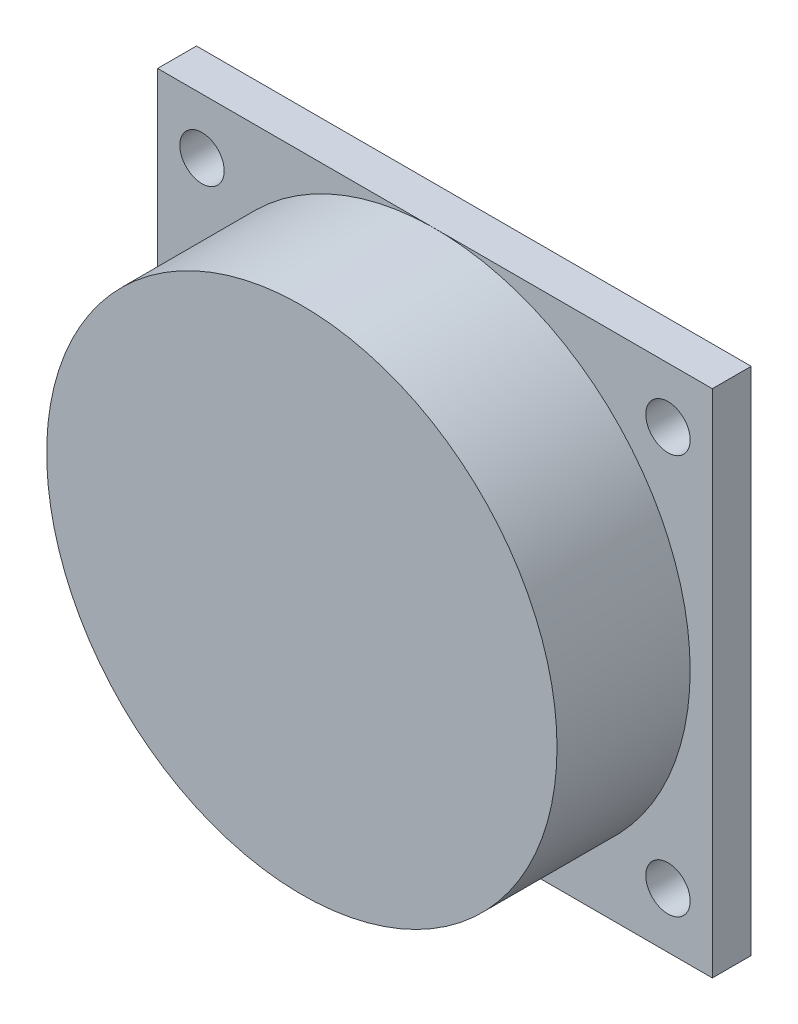
ISO-10303-21;
HEADER;
FILE_DESCRIPTION(('STEP AP214'),'2;1');
FILE_NAME('part.step','',(''),(''),'','','');
FILE_SCHEMA(('AUTOMOTIVE_DESIGN { 1 0 10303 214 1 1 1 1 }'));
ENDSEC;
DATA;
#1=APPLICATION_CONTEXT('core data for automotive mechanical design processes');
#2=APPLICATION_PROTOCOL_DEFINITION('international standard','automotive_design',2000,#1);
#3=PRODUCT_CONTEXT('',#1,'mechanical');
#4=PRODUCT('Part','Part','',(#3));
#5=PRODUCT_RELATED_PRODUCT_CATEGORY('part','',(#4));
#6=PRODUCT_DEFINITION_FORMATION('','',#4);
#7=PRODUCT_DEFINITION_CONTEXT('part definition',#1,'design');
#8=PRODUCT_DEFINITION('design','',#6,#7);
#9=PRODUCT_DEFINITION_SHAPE('','',#8);
#10=(LENGTH_UNIT() NAMED_UNIT(*) SI_UNIT(.MILLI.,.METRE.));
#11=(NAMED_UNIT(*) PLANE_ANGLE_UNIT() SI_UNIT($,.RADIAN.));
#12=(NAMED_UNIT(*) SI_UNIT($,.STERADIAN.) SOLID_ANGLE_UNIT());
#13=UNCERTAINTY_MEASURE_WITH_UNIT(LENGTH_MEASURE(1.E-05),#10,'distance_accuracy_value','');
#14=(GEOMETRIC_REPRESENTATION_CONTEXT(3) GLOBAL_UNCERTAINTY_ASSIGNED_CONTEXT((#13)) GLOBAL_UNIT_ASSIGNED_CONTEXT((#10,
#11,#12)) REPRESENTATION_CONTEXT('',''));
#15=CARTESIAN_POINT('',(0.,0.,0.));
#16=DIRECTION('',(0.,0.,1.));
#17=DIRECTION('',(1.,0.,0.));
#18=AXIS2_PLACEMENT_3D('',#15,#16,#17);
#19=CARTESIAN_POINT('',(0.,0.,-1.75));
#20=DIRECTION('',(0.,0.,-1.));
#21=DIRECTION('',(-1.,0.,0.));
#22=AXIS2_PLACEMENT_3D('',#19,#20,#21);
#23=PLANE('',#22);
#24=CARTESIAN_POINT('',(-10.5,9.,-1.75));
#25=DIRECTION('',(0.,0.,1.));
#26=DIRECTION('',(1.,0.,0.));
#27=AXIS2_PLACEMENT_3D('',#24,#25,#26);
#28=CIRCLE('',#27,0.999999999999999);
#29=CARTESIAN_POINT('',(-9.5,9.,-1.75));
#30=VERTEX_POINT('',#29);
#31=EDGE_CURVE('E205',#30,#30,#28,.T.);
#32=ORIENTED_EDGE('',*,*,#31,.T.);
#33=EDGE_LOOP('',(#32));
#34=FACE_BOUND('',#33,.T.);
#35=CARTESIAN_POINT('',(10.5,9.,-1.75));
#36=DIRECTION('',(0.,0.,1.));
#37=DIRECTION('',(1.,0.,0.));
#38=AXIS2_PLACEMENT_3D('',#35,#36,#37);
#39=CIRCLE('',#38,0.999999999999999);
#40=CARTESIAN_POINT('',(11.5,9.,-1.75));
#41=VERTEX_POINT('',#40);
#42=EDGE_CURVE('E199',#41,#41,#39,.T.);
#43=ORIENTED_EDGE('',*,*,#42,.T.);
#44=EDGE_LOOP('',(#43));
#45=FACE_BOUND('',#44,.T.);
#46=CARTESIAN_POINT('',(10.5,-9.,-1.75));
#47=DIRECTION('',(0.,0.,1.));
#48=DIRECTION('',(1.,0.,0.));
#49=AXIS2_PLACEMENT_3D('',#46,#47,#48);
#50=CIRCLE('',#49,0.999999999999999);
#51=CARTESIAN_POINT('',(11.5,-9.,-1.75));
#52=VERTEX_POINT('',#51);
#53=EDGE_CURVE('E193',#52,#52,#50,.T.);
#54=ORIENTED_EDGE('',*,*,#53,.T.);
#55=EDGE_LOOP('',(#54));
#56=FACE_BOUND('',#55,.T.);
#57=CARTESIAN_POINT('',(-10.5,-8.5,-1.75));
#58=DIRECTION('',(0.,0.,1.));
#59=DIRECTION('',(1.,0.,0.));
#60=AXIS2_PLACEMENT_3D('',#57,#58,#59);
#61=CIRCLE('',#60,0.999999999999999);
#62=CARTESIAN_POINT('',(-9.5,-8.5,-1.75));
#63=VERTEX_POINT('',#62);
#64=EDGE_CURVE('E130',#63,#63,#61,.T.);
#65=ORIENTED_EDGE('',*,*,#64,.T.);
#66=EDGE_LOOP('',(#65));
#67=FACE_BOUND('',#66,.T.);
#68=DIRECTION('',(0.,-1.,0.));
#69=VECTOR('',#68,1.);
#70=CARTESIAN_POINT('',(-2.6349857419825,-6.5,-1.75));
#71=LINE('',#70,#69);
#72=CARTESIAN_POINT('',(-2.6349857419825,-9.90552119474533,-1.75));
#73=VERTEX_POINT('',#72);
#74=CARTESIAN_POINT('',(-2.6349857419825,-11.5,-1.75));
#75=VERTEX_POINT('',#74);
#76=EDGE_CURVE('E122',#73,#75,#71,.T.);
#77=ORIENTED_EDGE('',*,*,#76,.T.);
#78=DIRECTION('',(-1.,0.,0.));
#79=VECTOR('',#78,1.);
#80=CARTESIAN_POINT('',(-12.5,-11.5,-1.75));
#81=LINE('',#80,#79);
#82=CARTESIAN_POINT('',(-12.5,-11.5,-1.75));
#83=VERTEX_POINT('',#82);
#84=EDGE_CURVE('E133',#75,#83,#81,.T.);
#85=ORIENTED_EDGE('',*,*,#84,.T.);
#86=DIRECTION('',(0.,1.,0.));
#87=VECTOR('',#86,1.);
#88=CARTESIAN_POINT('',(-12.5,-11.5,-1.75));
#89=LINE('',#88,#87);
#90=CARTESIAN_POINT('',(-12.5,11.5,-1.75));
#91=VERTEX_POINT('',#90);
#92=EDGE_CURVE('E147',#83,#91,#89,.T.);
#93=ORIENTED_EDGE('',*,*,#92,.T.);
#94=DIRECTION('',(1.,0.,0.));
#95=VECTOR('',#94,1.);
#96=CARTESIAN_POINT('',(-12.5,11.5,-1.75));
#97=LINE('',#96,#95);
#98=CARTESIAN_POINT('',(12.5,11.5,-1.75));
#99=VERTEX_POINT('',#98);
#100=EDGE_CURVE('E69',#91,#99,#97,.T.);
#101=ORIENTED_EDGE('',*,*,#100,.T.);
#102=DIRECTION('',(0.,-1.,0.));
#103=VECTOR('',#102,1.);
#104=CARTESIAN_POINT('',(12.5,-11.5,-1.75));
#105=LINE('',#104,#103);
#106=CARTESIAN_POINT('',(12.5,-11.5,-1.75));
#107=VERTEX_POINT('',#106);
#108=EDGE_CURVE('E145',#99,#107,#105,.T.);
#109=ORIENTED_EDGE('',*,*,#108,.T.);
#110=CARTESIAN_POINT('',(2.65652164277661,-11.5,-1.75));
#111=VERTEX_POINT('',#110);
#112=EDGE_CURVE('E98',#107,#111,#81,.T.);
#113=ORIENTED_EDGE('',*,*,#112,.T.);
#114=DIRECTION('',(0.,-1.,0.));
#115=VECTOR('',#114,1.);
#116=CARTESIAN_POINT('',(2.65652164277661,-6.5,-1.75));
#117=LINE('',#116,#115);
#118=CARTESIAN_POINT('',(2.65652164277661,-9.89976730845021,-1.75));
#119=VERTEX_POINT('',#118);
#120=EDGE_CURVE('E138',#119,#111,#117,.T.);
#121=ORIENTED_EDGE('',*,*,#120,.F.);
#122=CARTESIAN_POINT('',(0.,0.,-1.75));
#123=DIRECTION('',(0.,0.,-1.));
#124=DIRECTION('',(-1.,0.,0.));
#125=AXIS2_PLACEMENT_3D('',#122,#123,#124);
#126=CIRCLE('',#125,10.25);
#127=EDGE_CURVE('E137',#73,#119,#126,.T.);
#128=ORIENTED_EDGE('',*,*,#127,.F.);
#129=EDGE_LOOP('',(#77,#85,#93,#101,#109,#113,#121,#128));
#130=FACE_BOUND('',#129,.T.);
#131=ADVANCED_FACE('F45',(#34,#45,#56,#67,#130),#23,.T.);
#132=CARTESIAN_POINT('',(0.,0.,0.));
#133=DIRECTION('',(0.,0.,-1.));
#134=DIRECTION('',(-1.,0.,0.));
#135=AXIS2_PLACEMENT_3D('',#132,#133,#134);
#136=PLANE('',#135);
#137=CARTESIAN_POINT('',(-10.5,9.,0.));
#138=DIRECTION('',(0.,0.,1.));
#139=DIRECTION('',(1.,0.,0.));
#140=AXIS2_PLACEMENT_3D('',#137,#138,#139);
#141=CIRCLE('',#140,0.999999999999987);
#142=CARTESIAN_POINT('',(-9.50000000000001,9.,0.));
#143=VERTEX_POINT('',#142);
#144=EDGE_CURVE('E208',#143,#143,#141,.T.);
#145=ORIENTED_EDGE('',*,*,#144,.F.);
#146=EDGE_LOOP('',(#145));
#147=FACE_BOUND('',#146,.T.);
#148=CARTESIAN_POINT('',(10.5,9.,0.));
#149=DIRECTION('',(0.,0.,1.));
#150=DIRECTION('',(1.,0.,0.));
#151=AXIS2_PLACEMENT_3D('',#148,#149,#150);
#152=CIRCLE('',#151,0.999999999999987);
#153=CARTESIAN_POINT('',(11.5,9.,0.));
#154=VERTEX_POINT('',#153);
#155=EDGE_CURVE('E202',#154,#154,#152,.T.);
#156=ORIENTED_EDGE('',*,*,#155,.F.);
#157=EDGE_LOOP('',(#156));
#158=FACE_BOUND('',#157,.T.);
#159=CARTESIAN_POINT('',(10.5,-9.,0.));
#160=DIRECTION('',(0.,0.,1.));
#161=DIRECTION('',(1.,0.,0.));
#162=AXIS2_PLACEMENT_3D('',#159,#160,#161);
#163=CIRCLE('',#162,0.999999999999987);
#164=CARTESIAN_POINT('',(11.5,-9.,0.));
#165=VERTEX_POINT('',#164);
#166=EDGE_CURVE('E196',#165,#165,#163,.T.);
#167=ORIENTED_EDGE('',*,*,#166,.F.);
#168=EDGE_LOOP('',(#167));
#169=FACE_BOUND('',#168,.T.);
#170=CARTESIAN_POINT('',(-10.5,-8.5,0.));
#171=DIRECTION('',(0.,0.,1.));
#172=DIRECTION('',(1.,0.,0.));
#173=AXIS2_PLACEMENT_3D('',#170,#171,#172);
#174=CIRCLE('',#173,0.999999999999987);
#175=CARTESIAN_POINT('',(-9.50000000000001,-8.5,0.));
#176=VERTEX_POINT('',#175);
#177=EDGE_CURVE('E190',#176,#176,#174,.T.);
#178=ORIENTED_EDGE('',*,*,#177,.F.);
#179=EDGE_LOOP('',(#178));
#180=FACE_BOUND('',#179,.T.);
#181=DIRECTION('',(0.,-1.,0.));
#182=VECTOR('',#181,1.);
#183=CARTESIAN_POINT('',(12.5,-11.5,0.));
#184=LINE('',#183,#182);
#185=CARTESIAN_POINT('',(12.5,11.5,0.));
#186=VERTEX_POINT('',#185);
#187=CARTESIAN_POINT('',(12.5,-11.5,0.));
#188=VERTEX_POINT('',#187);
#189=EDGE_CURVE('E154',#186,#188,#184,.T.);
#190=ORIENTED_EDGE('',*,*,#189,.F.);
#191=DIRECTION('',(1.,0.,0.));
#192=VECTOR('',#191,1.);
#193=CARTESIAN_POINT('',(-12.5,11.5,0.));
#194=LINE('',#193,#192);
#195=CARTESIAN_POINT('',(-12.5,11.5,0.));
#196=VERTEX_POINT('',#195);
#197=EDGE_CURVE('E90',#196,#186,#194,.T.);
#198=ORIENTED_EDGE('',*,*,#197,.F.);
#199=DIRECTION('',(0.,1.,0.));
#200=VECTOR('',#199,1.);
#201=CARTESIAN_POINT('',(-12.5,-11.5,0.));
#202=LINE('',#201,#200);
#203=CARTESIAN_POINT('',(-12.5,-11.5,0.));
#204=VERTEX_POINT('',#203);
#205=EDGE_CURVE('E159',#204,#196,#202,.T.);
#206=ORIENTED_EDGE('',*,*,#205,.F.);
#207=DIRECTION('',(-1.,0.,0.));
#208=VECTOR('',#207,1.);
#209=CARTESIAN_POINT('',(-12.5,-11.5,0.));
#210=LINE('',#209,#208);
#211=EDGE_CURVE('E157',#188,#204,#210,.T.);
#212=ORIENTED_EDGE('',*,*,#211,.F.);
#213=EDGE_LOOP('',(#190,#198,#206,#212));
#214=FACE_BOUND('',#213,.T.);
#215=CARTESIAN_POINT('',(0.,0.,0.));
#216=DIRECTION('',(0.,0.,-1.));
#217=DIRECTION('',(-1.,0.,0.));
#218=AXIS2_PLACEMENT_3D('',#215,#216,#217);
#219=CIRCLE('',#218,10.25);
#220=CARTESIAN_POINT('',(-10.25,0.,0.));
#221=VERTEX_POINT('',#220);
#222=EDGE_CURVE('E181',#221,#221,#219,.T.);
#223=ORIENTED_EDGE('',*,*,#222,.T.);
#224=EDGE_LOOP('',(#223));
#225=FACE_BOUND('',#224,.T.);
#226=ADVANCED_FACE('F214',(#147,#158,#169,#180,#214,#225),#136,.F.);
#227=CARTESIAN_POINT('',(12.5,-11.5,-1.75));
#228=DIRECTION('',(-1.,0.,0.));
#229=DIRECTION('',(0.,-1.,0.));
#230=AXIS2_PLACEMENT_3D('',#227,#228,#229);
#231=PLANE('',#230);
#232=ORIENTED_EDGE('',*,*,#189,.T.);
#233=DIRECTION('',(0.,0.,1.));
#234=VECTOR('',#233,1.);
#235=CARTESIAN_POINT('',(12.5,-11.5,-1.75));
#236=LINE('',#235,#234);
#237=EDGE_CURVE('E166',#107,#188,#236,.T.);
#238=ORIENTED_EDGE('',*,*,#237,.F.);
#239=ORIENTED_EDGE('',*,*,#108,.F.);
#240=DIRECTION('',(0.,0.,1.));
#241=VECTOR('',#240,1.);
#242=CARTESIAN_POINT('',(12.5,11.5,-1.75));
#243=LINE('',#242,#241);
#244=EDGE_CURVE('E153',#99,#186,#243,.T.);
#245=ORIENTED_EDGE('',*,*,#244,.T.);
#246=EDGE_LOOP('',(#232,#238,#239,#245));
#247=FACE_BOUND('',#246,.T.);
#248=ADVANCED_FACE('F47',(#247),#231,.F.);
#249=CARTESIAN_POINT('',(-12.5,-11.5,-1.75));
#250=DIRECTION('',(0.,1.,0.));
#251=DIRECTION('',(-1.,0.,0.));
#252=AXIS2_PLACEMENT_3D('',#249,#250,#251);
#253=PLANE('',#252);
#254=ORIENTED_EDGE('',*,*,#84,.F.);
#255=DIRECTION('',(0.,0.,-1.));
#256=VECTOR('',#255,1.);
#257=CARTESIAN_POINT('',(-2.6349857419825,-11.5,-1.75));
#258=LINE('',#257,#256);
#259=CARTESIAN_POINT('',(-2.6349857419825,-11.5,-1.51062213355671));
#260=VERTEX_POINT('',#259);
#261=EDGE_CURVE('E119',#260,#75,#258,.T.);
#262=ORIENTED_EDGE('',*,*,#261,.F.);
#263=DIRECTION('',(-1.,0.,0.));
#264=VECTOR('',#263,1.);
#265=CARTESIAN_POINT('',(-2.6349857419825,-11.5,-1.51062213355671));
#266=LINE('',#265,#264);
#267=CARTESIAN_POINT('',(2.65652164277661,-11.5,-1.51062213355671));
#268=VERTEX_POINT('',#267);
#269=EDGE_CURVE('E139',#268,#260,#266,.T.);
#270=ORIENTED_EDGE('',*,*,#269,.F.);
#271=DIRECTION('',(0.,0.,1.));
#272=VECTOR('',#271,1.);
#273=CARTESIAN_POINT('',(2.65652164277661,-11.5,-1.75));
#274=LINE('',#273,#272);
#275=EDGE_CURVE('E129',#111,#268,#274,.T.);
#276=ORIENTED_EDGE('',*,*,#275,.F.);
#277=ORIENTED_EDGE('',*,*,#112,.F.);
#278=ORIENTED_EDGE('',*,*,#237,.T.);
#279=ORIENTED_EDGE('',*,*,#211,.T.);
#280=DIRECTION('',(0.,0.,1.));
#281=VECTOR('',#280,1.);
#282=CARTESIAN_POINT('',(-12.5,-11.5,-1.75));
#283=LINE('',#282,#281);
#284=EDGE_CURVE('E143',#83,#204,#283,.T.);
#285=ORIENTED_EDGE('',*,*,#284,.F.);
#286=EDGE_LOOP('',(#254,#262,#270,#276,#277,#278,#279,#285));
#287=FACE_BOUND('',#286,.T.);
#288=ADVANCED_FACE('F141',(#287),#253,.F.);
#289=CARTESIAN_POINT('',(-12.5,-11.5,-1.75));
#290=DIRECTION('',(1.,0.,0.));
#291=DIRECTION('',(0.,0.,-1.));
#292=AXIS2_PLACEMENT_3D('',#289,#290,#291);
#293=PLANE('',#292);
#294=ORIENTED_EDGE('',*,*,#205,.T.);
#295=DIRECTION('',(0.,0.,1.));
#296=VECTOR('',#295,1.);
#297=CARTESIAN_POINT('',(-12.5,11.5,-1.75));
#298=LINE('',#297,#296);
#299=EDGE_CURVE('E163',#91,#196,#298,.T.);
#300=ORIENTED_EDGE('',*,*,#299,.F.);
#301=ORIENTED_EDGE('',*,*,#92,.F.);
#302=ORIENTED_EDGE('',*,*,#284,.T.);
#303=EDGE_LOOP('',(#294,#300,#301,#302));
#304=FACE_BOUND('',#303,.T.);
#305=ADVANCED_FACE('F232',(#304),#293,.F.);
#306=CARTESIAN_POINT('',(-12.5,11.5,-1.75));
#307=DIRECTION('',(0.,-1.,0.));
#308=DIRECTION('',(1.,0.,0.));
#309=AXIS2_PLACEMENT_3D('',#306,#307,#308);
#310=PLANE('',#309);
#311=ORIENTED_EDGE('',*,*,#197,.T.);
#312=ORIENTED_EDGE('',*,*,#244,.F.);
#313=ORIENTED_EDGE('',*,*,#100,.F.);
#314=ORIENTED_EDGE('',*,*,#299,.T.);
#315=EDGE_LOOP('',(#311,#312,#313,#314));
#316=FACE_BOUND('',#315,.T.);
#317=ADVANCED_FACE('F229',(#316),#310,.F.);
#318=CARTESIAN_POINT('',(0.,0.,-1.75));
#319=DIRECTION('',(0.,0.,1.));
#320=DIRECTION('',(1.,0.,0.));
#321=AXIS2_PLACEMENT_3D('',#318,#319,#320);
#322=CYLINDRICAL_SURFACE('',#321,10.25);
#323=DIRECTION('',(0.,0.,1.));
#324=VECTOR('',#323,1.);
#325=CARTESIAN_POINT('',(-2.6349857419825,-9.90552119474533,-1.75));
#326=LINE('',#325,#324);
#327=CARTESIAN_POINT('',(-2.6349857419825,-9.90552119474533,-1.51062213355671));
#328=VERTEX_POINT('',#327);
#329=EDGE_CURVE('E12',#73,#328,#326,.T.);
#330=ORIENTED_EDGE('',*,*,#329,.F.);
#331=ORIENTED_EDGE('',*,*,#127,.T.);
#332=DIRECTION('',(0.,0.,1.));
#333=VECTOR('',#332,1.);
#334=CARTESIAN_POINT('',(2.65652164277661,-9.89976730845021,-1.75));
#335=LINE('',#334,#333);
#336=CARTESIAN_POINT('',(2.65652164277661,-9.89976730845021,-1.51062213355671));
#337=VERTEX_POINT('',#336);
#338=EDGE_CURVE('E168',#337,#119,#335,.F.);
#339=ORIENTED_EDGE('',*,*,#338,.F.);
#340=CARTESIAN_POINT('',(0.,0.,-1.51062213355671));
#341=DIRECTION('',(0.,0.,1.));
#342=DIRECTION('',(1.,0.,0.));
#343=AXIS2_PLACEMENT_3D('',#340,#341,#342);
#344=CIRCLE('',#343,10.25);
#345=EDGE_CURVE('E53',#328,#337,#344,.T.);
#346=ORIENTED_EDGE('',*,*,#345,.F.);
#347=EDGE_LOOP('',(#330,#331,#339,#346));
#348=FACE_BOUND('',#347,.T.);
#349=ORIENTED_EDGE('',*,*,#222,.F.);
#350=EDGE_LOOP('',(#349));
#351=FACE_BOUND('',#350,.T.);
#352=ADVANCED_FACE('F174',(#348,#351),#322,.F.);
#353=CARTESIAN_POINT('',(-2.6349857419825,-6.5,-1.75));
#354=DIRECTION('',(-1.,0.,0.));
#355=DIRECTION('',(0.,-1.,0.));
#356=AXIS2_PLACEMENT_3D('',#353,#354,#355);
#357=PLANE('',#356);
#358=ORIENTED_EDGE('',*,*,#329,.T.);
#359=DIRECTION('',(0.,-1.,0.));
#360=VECTOR('',#359,1.);
#361=CARTESIAN_POINT('',(-2.6349857419825,-6.5,-1.51062213355671));
#362=LINE('',#361,#360);
#363=EDGE_CURVE('E125',#328,#260,#362,.T.);
#364=ORIENTED_EDGE('',*,*,#363,.T.);
#365=ORIENTED_EDGE('',*,*,#261,.T.);
#366=ORIENTED_EDGE('',*,*,#76,.F.);
#367=EDGE_LOOP('',(#358,#364,#365,#366));
#368=FACE_BOUND('',#367,.T.);
#369=ADVANCED_FACE('F121',(#368),#357,.F.);
#370=CARTESIAN_POINT('',(-2.6349857419825,-6.5,-1.51062213355671));
#371=DIRECTION('',(0.,0.,1.));
#372=DIRECTION('',(1.,0.,0.));
#373=AXIS2_PLACEMENT_3D('',#370,#371,#372);
#374=PLANE('',#373);
#375=ORIENTED_EDGE('',*,*,#345,.T.);
#376=DIRECTION('',(0.,-1.,0.));
#377=VECTOR('',#376,1.);
#378=CARTESIAN_POINT('',(2.65652164277661,-6.5,-1.51062213355671));
#379=LINE('',#378,#377);
#380=EDGE_CURVE('E60',#337,#268,#379,.T.);
#381=ORIENTED_EDGE('',*,*,#380,.T.);
#382=ORIENTED_EDGE('',*,*,#269,.T.);
#383=ORIENTED_EDGE('',*,*,#363,.F.);
#384=EDGE_LOOP('',(#375,#381,#382,#383));
#385=FACE_BOUND('',#384,.T.);
#386=ADVANCED_FACE('F172',(#385),#374,.F.);
#387=CARTESIAN_POINT('',(2.65652164277661,-6.5,-1.75));
#388=DIRECTION('',(1.,0.,0.));
#389=DIRECTION('',(0.,1.,0.));
#390=AXIS2_PLACEMENT_3D('',#387,#388,#389);
#391=PLANE('',#390);
#392=ORIENTED_EDGE('',*,*,#338,.T.);
#393=ORIENTED_EDGE('',*,*,#120,.T.);
#394=ORIENTED_EDGE('',*,*,#275,.T.);
#395=ORIENTED_EDGE('',*,*,#380,.F.);
#396=EDGE_LOOP('',(#392,#393,#394,#395));
#397=FACE_BOUND('',#396,.T.);
#398=ADVANCED_FACE('F176',(#397),#391,.F.);
#399=CARTESIAN_POINT('',(-10.5,-8.5,0.));
#400=DIRECTION('',(0.,0.,1.));
#401=DIRECTION('',(1.,0.,0.));
#402=AXIS2_PLACEMENT_3D('',#399,#400,#401);
#403=CYLINDRICAL_SURFACE('',#402,0.999999999999993);
#404=ORIENTED_EDGE('',*,*,#64,.F.);
#405=EDGE_LOOP('',(#404));
#406=FACE_BOUND('',#405,.T.);
#407=ORIENTED_EDGE('',*,*,#177,.T.);
#408=EDGE_LOOP('',(#407));
#409=FACE_BOUND('',#408,.T.);
#410=ADVANCED_FACE('F253',(#406,#409),#403,.F.);
#411=CARTESIAN_POINT('',(10.5,-9.,0.));
#412=DIRECTION('',(0.,0.,1.));
#413=DIRECTION('',(1.,0.,0.));
#414=AXIS2_PLACEMENT_3D('',#411,#412,#413);
#415=CYLINDRICAL_SURFACE('',#414,0.999999999999993);
#416=ORIENTED_EDGE('',*,*,#53,.F.);
#417=EDGE_LOOP('',(#416));
#418=FACE_BOUND('',#417,.T.);
#419=ORIENTED_EDGE('',*,*,#166,.T.);
#420=EDGE_LOOP('',(#419));
#421=FACE_BOUND('',#420,.T.);
#422=ADVANCED_FACE('F258',(#418,#421),#415,.F.);
#423=CARTESIAN_POINT('',(10.5,9.,0.));
#424=DIRECTION('',(0.,0.,1.));
#425=DIRECTION('',(1.,0.,0.));
#426=AXIS2_PLACEMENT_3D('',#423,#424,#425);
#427=CYLINDRICAL_SURFACE('',#426,0.999999999999993);
#428=ORIENTED_EDGE('',*,*,#42,.F.);
#429=EDGE_LOOP('',(#428));
#430=FACE_BOUND('',#429,.T.);
#431=ORIENTED_EDGE('',*,*,#155,.T.);
#432=EDGE_LOOP('',(#431));
#433=FACE_BOUND('',#432,.T.);
#434=ADVANCED_FACE('F262',(#430,#433),#427,.F.);
#435=CARTESIAN_POINT('',(-10.5,9.,0.));
#436=DIRECTION('',(0.,0.,1.));
#437=DIRECTION('',(1.,0.,0.));
#438=AXIS2_PLACEMENT_3D('',#435,#436,#437);
#439=CYLINDRICAL_SURFACE('',#438,0.999999999999993);
#440=ORIENTED_EDGE('',*,*,#31,.F.);
#441=EDGE_LOOP('',(#440));
#442=FACE_BOUND('',#441,.T.);
#443=ORIENTED_EDGE('',*,*,#144,.T.);
#444=EDGE_LOOP('',(#443));
#445=FACE_BOUND('',#444,.T.);
#446=ADVANCED_FACE('F212',(#442,#445),#439,.F.);
#447=CLOSED_SHELL('',(#131,#226,#248,#288,#305,#317,#352,#369,#386,#398,#410,#422,#434,#446));
#448=MANIFOLD_SOLID_BREP('B2',#447);
#449=CARTESIAN_POINT('',(0.,0.,0.));
#450=DIRECTION('',(0.,0.,1.));
#451=DIRECTION('',(1.,0.,0.));
#452=AXIS2_PLACEMENT_3D('',#449,#450,#451);
#453=PLANE('',#452);
#454=CARTESIAN_POINT('',(0.,0.,0.));
#455=DIRECTION('',(0.,0.,1.));
#456=DIRECTION('',(1.,0.,0.));
#457=AXIS2_PLACEMENT_3D('',#454,#455,#456);
#458=CIRCLE('',#457,11.5);
#459=CARTESIAN_POINT('',(11.5,0.,0.));
#460=VERTEX_POINT('',#459);
#461=EDGE_CURVE('E44',#460,#460,#458,.T.);
#462=ORIENTED_EDGE('',*,*,#461,.F.);
#463=EDGE_LOOP('',(#462));
#464=FACE_BOUND('',#463,.T.);
#465=CARTESIAN_POINT('',(0.,0.,0.));
#466=DIRECTION('',(0.,0.,1.));
#467=DIRECTION('',(1.,0.,0.));
#468=AXIS2_PLACEMENT_3D('',#465,#466,#467);
#469=CIRCLE('',#468,10.25);
#470=CARTESIAN_POINT('',(10.25,0.,0.));
#471=VERTEX_POINT('',#470);
#472=EDGE_CURVE('E369',#471,#471,#469,.T.);
#473=ORIENTED_EDGE('',*,*,#472,.T.);
#474=EDGE_LOOP('',(#473));
#475=FACE_BOUND('',#474,.T.);
#476=ADVANCED_FACE('F362',(#464,#475),#453,.F.);
#477=CARTESIAN_POINT('',(0.,0.,5.5));
#478=DIRECTION('',(0.,0.,-1.));
#479=DIRECTION('',(-1.,0.,0.));
#480=AXIS2_PLACEMENT_3D('',#477,#478,#479);
#481=CYLINDRICAL_SURFACE('',#480,11.5);
#482=ORIENTED_EDGE('',*,*,#461,.T.);
#483=EDGE_LOOP('',(#482));
#484=FACE_BOUND('',#483,.T.);
#485=CARTESIAN_POINT('',(0.,0.,6.));
#486=DIRECTION('',(0.,0.,1.));
#487=DIRECTION('',(1.,0.,0.));
#488=AXIS2_PLACEMENT_3D('',#485,#486,#487);
#489=CIRCLE('',#488,11.5);
#490=CARTESIAN_POINT('',(11.5,0.,6.));
#491=VERTEX_POINT('',#490);
#492=EDGE_CURVE('E377',#491,#491,#489,.T.);
#493=ORIENTED_EDGE('',*,*,#492,.F.);
#494=EDGE_LOOP('',(#493));
#495=FACE_BOUND('',#494,.T.);
#496=ADVANCED_FACE('F364',(#484,#495),#481,.T.);
#497=CARTESIAN_POINT('',(0.,0.,5.5));
#498=DIRECTION('',(0.,0.,-1.));
#499=DIRECTION('',(-1.,0.,0.));
#500=AXIS2_PLACEMENT_3D('',#497,#498,#499);
#501=CYLINDRICAL_SURFACE('',#500,10.25);
#502=CARTESIAN_POINT('',(0.,0.,5.5));
#503=DIRECTION('',(0.,0.,1.));
#504=DIRECTION('',(1.,0.,0.));
#505=AXIS2_PLACEMENT_3D('',#502,#503,#504);
#506=CIRCLE('',#505,10.25);
#507=CARTESIAN_POINT('',(10.25,0.,5.5));
#508=VERTEX_POINT('',#507);
#509=EDGE_CURVE('E373',#508,#508,#506,.T.);
#510=ORIENTED_EDGE('',*,*,#509,.T.);
#511=EDGE_LOOP('',(#510));
#512=FACE_BOUND('',#511,.T.);
#513=ORIENTED_EDGE('',*,*,#472,.F.);
#514=EDGE_LOOP('',(#513));
#515=FACE_BOUND('',#514,.T.);
#516=ADVANCED_FACE('F386',(#512,#515),#501,.F.);
#517=CARTESIAN_POINT('',(0.,0.,5.5));
#518=DIRECTION('',(0.,0.,1.));
#519=DIRECTION('',(1.,0.,0.));
#520=AXIS2_PLACEMENT_3D('',#517,#518,#519);
#521=PLANE('',#520);
#522=ORIENTED_EDGE('',*,*,#509,.F.);
#523=EDGE_LOOP('',(#522));
#524=FACE_BOUND('',#523,.T.);
#525=ADVANCED_FACE('F391',(#524),#521,.F.);
#526=CARTESIAN_POINT('',(0.,0.,6.));
#527=DIRECTION('',(0.,0.,1.));
#528=DIRECTION('',(1.,0.,0.));
#529=AXIS2_PLACEMENT_3D('',#526,#527,#528);
#530=PLANE('',#529);
#531=ORIENTED_EDGE('',*,*,#492,.T.);
#532=EDGE_LOOP('',(#531));
#533=FACE_BOUND('',#532,.T.);
#534=ADVANCED_FACE('F383',(#533),#530,.T.);
#535=CLOSED_SHELL('',(#476,#496,#516,#525,#534));
#536=MANIFOLD_SOLID_BREP('B6',#535);
#537=ADVANCED_BREP_SHAPE_REPRESENTATION('',(#18,#448,#536),#14);
#538=SHAPE_DEFINITION_REPRESENTATION(#9,#537);
ENDSEC;
END-ISO-10303-21;
